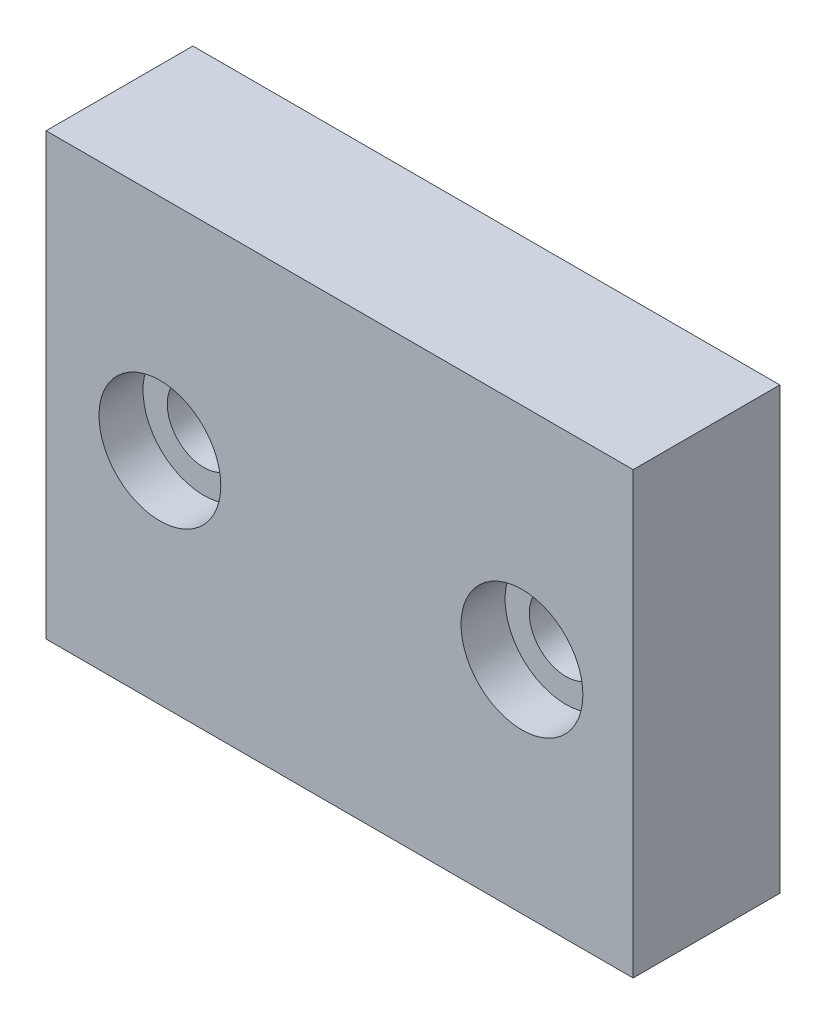
ISO-10303-21;
HEADER;
FILE_DESCRIPTION(('STEP AP214'),'2;1');
FILE_NAME('part.step','',(''),(''),'','','');
FILE_SCHEMA(('AUTOMOTIVE_DESIGN { 1 0 10303 214 1 1 1 1 }'));
ENDSEC;
DATA;
#1=APPLICATION_CONTEXT('core data for automotive mechanical design processes');
#2=APPLICATION_PROTOCOL_DEFINITION('international standard','automotive_design',2000,#1);
#3=PRODUCT_CONTEXT('',#1,'mechanical');
#4=PRODUCT('Part','Part','',(#3));
#5=PRODUCT_RELATED_PRODUCT_CATEGORY('part','',(#4));
#6=PRODUCT_DEFINITION_FORMATION('','',#4);
#7=PRODUCT_DEFINITION_CONTEXT('part definition',#1,'design');
#8=PRODUCT_DEFINITION('design','',#6,#7);
#9=PRODUCT_DEFINITION_SHAPE('','',#8);
#10=(LENGTH_UNIT() NAMED_UNIT(*) SI_UNIT(.MILLI.,.METRE.));
#11=(NAMED_UNIT(*) PLANE_ANGLE_UNIT() SI_UNIT($,.RADIAN.));
#12=(NAMED_UNIT(*) SI_UNIT($,.STERADIAN.) SOLID_ANGLE_UNIT());
#13=UNCERTAINTY_MEASURE_WITH_UNIT(LENGTH_MEASURE(1.E-05),#10,'distance_accuracy_value','');
#14=(GEOMETRIC_REPRESENTATION_CONTEXT(3) GLOBAL_UNCERTAINTY_ASSIGNED_CONTEXT((#13)) GLOBAL_UNIT_ASSIGNED_CONTEXT((#10,
#11,#12)) REPRESENTATION_CONTEXT('',''));
#15=CARTESIAN_POINT('',(0.,0.,0.));
#16=DIRECTION('',(0.,0.,1.));
#17=DIRECTION('',(1.,0.,0.));
#18=AXIS2_PLACEMENT_3D('',#15,#16,#17);
#19=CARTESIAN_POINT('',(-67.7461410245669,15.,40.));
#20=DIRECTION('',(0.,0.,-1.));
#21=DIRECTION('',(-1.,0.,0.));
#22=AXIS2_PLACEMENT_3D('',#19,#20,#21);
#23=CYLINDRICAL_SURFACE('',#22,2.50000000000001);
#24=CARTESIAN_POINT('',(-67.7461410245669,15.,17.5));
#25=DIRECTION('',(0.,0.,1.));
#26=DIRECTION('',(1.,0.,0.));
#27=AXIS2_PLACEMENT_3D('',#24,#25,#26);
#28=CIRCLE('',#27,2.50000000000001);
#29=CARTESIAN_POINT('',(-65.2461410245669,15.,17.5));
#30=VERTEX_POINT('',#29);
#31=EDGE_CURVE('E111',#30,#30,#28,.T.);
#32=ORIENTED_EDGE('',*,*,#31,.F.);
#33=EDGE_LOOP('',(#32));
#34=FACE_BOUND('',#33,.T.);
#35=CARTESIAN_POINT('',(-67.7461410245669,15.,24.5));
#36=DIRECTION('',(0.,0.,1.));
#37=DIRECTION('',(1.,0.,0.));
#38=AXIS2_PLACEMENT_3D('',#35,#36,#37);
#39=CIRCLE('',#38,2.50000000000001);
#40=CARTESIAN_POINT('',(-65.2461410245669,15.,24.5));
#41=VERTEX_POINT('',#40);
#42=EDGE_CURVE('E37',#41,#41,#39,.F.);
#43=ORIENTED_EDGE('',*,*,#42,.F.);
#44=EDGE_LOOP('',(#43));
#45=FACE_BOUND('',#44,.T.);
#46=ADVANCED_FACE('F33',(#34,#45),#23,.F.);
#47=CARTESIAN_POINT('',(-43.0740192619808,15.,40.));
#48=DIRECTION('',(0.,0.,-1.));
#49=DIRECTION('',(-1.,0.,0.));
#50=AXIS2_PLACEMENT_3D('',#47,#48,#49);
#51=CYLINDRICAL_SURFACE('',#50,2.5);
#52=CARTESIAN_POINT('',(-43.0740192619808,15.,17.5));
#53=DIRECTION('',(0.,0.,1.));
#54=DIRECTION('',(1.,0.,0.));
#55=AXIS2_PLACEMENT_3D('',#52,#53,#54);
#56=CIRCLE('',#55,2.5);
#57=CARTESIAN_POINT('',(-40.5740192619808,15.,17.5));
#58=VERTEX_POINT('',#57);
#59=EDGE_CURVE('E102',#58,#58,#56,.T.);
#60=ORIENTED_EDGE('',*,*,#59,.F.);
#61=EDGE_LOOP('',(#60));
#62=FACE_BOUND('',#61,.T.);
#63=CARTESIAN_POINT('',(-43.0740192619808,15.,24.5));
#64=DIRECTION('',(0.,0.,1.));
#65=DIRECTION('',(1.,0.,0.));
#66=AXIS2_PLACEMENT_3D('',#63,#64,#65);
#67=CIRCLE('',#66,2.5);
#68=CARTESIAN_POINT('',(-40.5740192619808,15.,24.5));
#69=VERTEX_POINT('',#68);
#70=EDGE_CURVE('E115',#69,#69,#67,.F.);
#71=ORIENTED_EDGE('',*,*,#70,.F.);
#72=EDGE_LOOP('',(#71));
#73=FACE_BOUND('',#72,.T.);
#74=ADVANCED_FACE('F154',(#62,#73),#51,.F.);
#75=CARTESIAN_POINT('',(-75.4989459475582,0.,27.5));
#76=DIRECTION('',(0.,1.,0.));
#77=DIRECTION('',(-1.,0.,0.));
#78=AXIS2_PLACEMENT_3D('',#75,#76,#77);
#79=PLANE('',#78);
#80=DIRECTION('',(1.,0.,0.));
#81=VECTOR('',#80,1.);
#82=CARTESIAN_POINT('',(-75.4989459475582,0.,17.5));
#83=LINE('',#82,#81);
#84=CARTESIAN_POINT('',(-75.4989459475582,0.,17.5));
#85=VERTEX_POINT('',#84);
#86=CARTESIAN_POINT('',(-35.4989459475582,0.,17.5));
#87=VERTEX_POINT('',#86);
#88=EDGE_CURVE('E100',#85,#87,#83,.T.);
#89=ORIENTED_EDGE('',*,*,#88,.T.);
#90=DIRECTION('',(0.,0.,-1.));
#91=VECTOR('',#90,1.);
#92=CARTESIAN_POINT('',(-35.4989459475582,0.,27.5));
#93=LINE('',#92,#91);
#94=CARTESIAN_POINT('',(-35.4989459475582,0.,27.5));
#95=VERTEX_POINT('',#94);
#96=EDGE_CURVE('E11',#95,#87,#93,.T.);
#97=ORIENTED_EDGE('',*,*,#96,.F.);
#98=DIRECTION('',(1.,0.,0.));
#99=VECTOR('',#98,1.);
#100=CARTESIAN_POINT('',(-75.4989459475582,0.,27.5));
#101=LINE('',#100,#99);
#102=CARTESIAN_POINT('',(-75.4989459475582,0.,27.5));
#103=VERTEX_POINT('',#102);
#104=EDGE_CURVE('E85',#103,#95,#101,.T.);
#105=ORIENTED_EDGE('',*,*,#104,.F.);
#106=DIRECTION('',(0.,0.,-1.));
#107=VECTOR('',#106,1.);
#108=CARTESIAN_POINT('',(-75.4989459475582,0.,27.5));
#109=LINE('',#108,#107);
#110=EDGE_CURVE('E52',#103,#85,#109,.T.);
#111=ORIENTED_EDGE('',*,*,#110,.T.);
#112=EDGE_LOOP('',(#89,#97,#105,#111));
#113=FACE_BOUND('',#112,.T.);
#114=ADVANCED_FACE('F35',(#113),#79,.F.);
#115=CARTESIAN_POINT('',(-35.4989459475582,0.,27.5));
#116=DIRECTION('',(-1.,0.,0.));
#117=DIRECTION('',(0.,0.,1.));
#118=AXIS2_PLACEMENT_3D('',#115,#116,#117);
#119=PLANE('',#118);
#120=DIRECTION('',(0.,1.,0.));
#121=VECTOR('',#120,1.);
#122=CARTESIAN_POINT('',(-35.4989459475582,0.,17.5));
#123=LINE('',#122,#121);
#124=CARTESIAN_POINT('',(-35.4989459475582,30.,17.5));
#125=VERTEX_POINT('',#124);
#126=EDGE_CURVE('E90',#87,#125,#123,.T.);
#127=ORIENTED_EDGE('',*,*,#126,.T.);
#128=DIRECTION('',(0.,0.,-1.));
#129=VECTOR('',#128,1.);
#130=CARTESIAN_POINT('',(-35.4989459475582,30.,27.5));
#131=LINE('',#130,#129);
#132=CARTESIAN_POINT('',(-35.4989459475582,30.,27.5));
#133=VERTEX_POINT('',#132);
#134=EDGE_CURVE('E43',#133,#125,#131,.T.);
#135=ORIENTED_EDGE('',*,*,#134,.F.);
#136=DIRECTION('',(0.,1.,0.));
#137=VECTOR('',#136,1.);
#138=CARTESIAN_POINT('',(-35.4989459475582,0.,27.5));
#139=LINE('',#138,#137);
#140=EDGE_CURVE('E77',#95,#133,#139,.T.);
#141=ORIENTED_EDGE('',*,*,#140,.F.);
#142=ORIENTED_EDGE('',*,*,#96,.T.);
#143=EDGE_LOOP('',(#127,#135,#141,#142));
#144=FACE_BOUND('',#143,.T.);
#145=ADVANCED_FACE('F89',(#144),#119,.F.);
#146=CARTESIAN_POINT('',(-75.4989459475582,30.,27.5));
#147=DIRECTION('',(0.,1.,0.));
#148=DIRECTION('',(0.,0.,1.));
#149=AXIS2_PLACEMENT_3D('',#146,#147,#148);
#150=PLANE('',#149);
#151=DIRECTION('',(1.,0.,0.));
#152=VECTOR('',#151,1.);
#153=CARTESIAN_POINT('',(-75.4989459475582,30.,17.5));
#154=LINE('',#153,#152);
#155=CARTESIAN_POINT('',(-75.4989459475582,30.,17.5));
#156=VERTEX_POINT('',#155);
#157=EDGE_CURVE('E104',#156,#125,#154,.T.);
#158=ORIENTED_EDGE('',*,*,#157,.F.);
#159=DIRECTION('',(0.,0.,-1.));
#160=VECTOR('',#159,1.);
#161=CARTESIAN_POINT('',(-75.4989459475582,30.,27.5));
#162=LINE('',#161,#160);
#163=CARTESIAN_POINT('',(-75.4989459475582,30.,27.5));
#164=VERTEX_POINT('',#163);
#165=EDGE_CURVE('E66',#164,#156,#162,.T.);
#166=ORIENTED_EDGE('',*,*,#165,.F.);
#167=DIRECTION('',(1.,0.,0.));
#168=VECTOR('',#167,1.);
#169=CARTESIAN_POINT('',(-75.4989459475582,30.,27.5));
#170=LINE('',#169,#168);
#171=EDGE_CURVE('E84',#164,#133,#170,.T.);
#172=ORIENTED_EDGE('',*,*,#171,.T.);
#173=ORIENTED_EDGE('',*,*,#134,.T.);
#174=EDGE_LOOP('',(#158,#166,#172,#173));
#175=FACE_BOUND('',#174,.T.);
#176=ADVANCED_FACE('F94',(#175),#150,.T.);
#177=CARTESIAN_POINT('',(-75.4989459475582,0.,27.5));
#178=DIRECTION('',(-1.,0.,0.));
#179=DIRECTION('',(0.,0.,1.));
#180=AXIS2_PLACEMENT_3D('',#177,#178,#179);
#181=PLANE('',#180);
#182=DIRECTION('',(0.,1.,0.));
#183=VECTOR('',#182,1.);
#184=CARTESIAN_POINT('',(-75.4989459475582,0.,17.5));
#185=LINE('',#184,#183);
#186=EDGE_CURVE('E106',#85,#156,#185,.T.);
#187=ORIENTED_EDGE('',*,*,#186,.F.);
#188=ORIENTED_EDGE('',*,*,#110,.F.);
#189=DIRECTION('',(0.,1.,0.));
#190=VECTOR('',#189,1.);
#191=CARTESIAN_POINT('',(-75.4989459475582,0.,27.5));
#192=LINE('',#191,#190);
#193=EDGE_CURVE('E95',#103,#164,#192,.T.);
#194=ORIENTED_EDGE('',*,*,#193,.T.);
#195=ORIENTED_EDGE('',*,*,#165,.T.);
#196=EDGE_LOOP('',(#187,#188,#194,#195));
#197=FACE_BOUND('',#196,.T.);
#198=ADVANCED_FACE('F140',(#197),#181,.T.);
#199=CARTESIAN_POINT('',(0.,0.,27.5));
#200=DIRECTION('',(0.,0.,1.));
#201=DIRECTION('',(1.,0.,0.));
#202=AXIS2_PLACEMENT_3D('',#199,#200,#201);
#203=PLANE('',#202);
#204=CARTESIAN_POINT('',(-67.7461410245669,15.,27.5));
#205=DIRECTION('',(0.,0.,1.));
#206=DIRECTION('',(1.,0.,0.));
#207=AXIS2_PLACEMENT_3D('',#204,#205,#206);
#208=CIRCLE('',#207,4.15);
#209=CARTESIAN_POINT('',(-63.5961410245669,15.,27.5));
#210=VERTEX_POINT('',#209);
#211=EDGE_CURVE('E122',#210,#210,#208,.T.);
#212=ORIENTED_EDGE('',*,*,#211,.F.);
#213=EDGE_LOOP('',(#212));
#214=FACE_BOUND('',#213,.T.);
#215=CARTESIAN_POINT('',(-43.0740192619808,15.,27.5));
#216=DIRECTION('',(0.,0.,1.));
#217=DIRECTION('',(1.,0.,0.));
#218=AXIS2_PLACEMENT_3D('',#215,#216,#217);
#219=CIRCLE('',#218,4.15);
#220=CARTESIAN_POINT('',(-38.9240192619808,15.,27.5));
#221=VERTEX_POINT('',#220);
#222=EDGE_CURVE('E132',#221,#221,#219,.T.);
#223=ORIENTED_EDGE('',*,*,#222,.F.);
#224=EDGE_LOOP('',(#223));
#225=FACE_BOUND('',#224,.T.);
#226=ORIENTED_EDGE('',*,*,#104,.T.);
#227=ORIENTED_EDGE('',*,*,#140,.T.);
#228=ORIENTED_EDGE('',*,*,#171,.F.);
#229=ORIENTED_EDGE('',*,*,#193,.F.);
#230=EDGE_LOOP('',(#226,#227,#228,#229));
#231=FACE_BOUND('',#230,.T.);
#232=ADVANCED_FACE('F81',(#214,#225,#231),#203,.T.);
#233=CARTESIAN_POINT('',(0.,0.,17.5));
#234=DIRECTION('',(0.,0.,1.));
#235=DIRECTION('',(1.,0.,0.));
#236=AXIS2_PLACEMENT_3D('',#233,#234,#235);
#237=PLANE('',#236);
#238=ORIENTED_EDGE('',*,*,#59,.T.);
#239=EDGE_LOOP('',(#238));
#240=FACE_BOUND('',#239,.T.);
#241=ORIENTED_EDGE('',*,*,#31,.T.);
#242=EDGE_LOOP('',(#241));
#243=FACE_BOUND('',#242,.T.);
#244=ORIENTED_EDGE('',*,*,#88,.F.);
#245=ORIENTED_EDGE('',*,*,#186,.T.);
#246=ORIENTED_EDGE('',*,*,#157,.T.);
#247=ORIENTED_EDGE('',*,*,#126,.F.);
#248=EDGE_LOOP('',(#244,#245,#246,#247));
#249=FACE_BOUND('',#248,.T.);
#250=ADVANCED_FACE('F139',(#240,#243,#249),#237,.F.);
#251=CARTESIAN_POINT('',(-43.0740192619808,15.,24.5));
#252=DIRECTION('',(0.,0.,1.));
#253=DIRECTION('',(1.,0.,0.));
#254=AXIS2_PLACEMENT_3D('',#251,#252,#253);
#255=PLANE('',#254);
#256=CARTESIAN_POINT('',(-43.0740192619808,15.,24.5));
#257=DIRECTION('',(0.,0.,1.));
#258=DIRECTION('',(1.,0.,0.));
#259=AXIS2_PLACEMENT_3D('',#256,#257,#258);
#260=CIRCLE('',#259,4.15);
#261=CARTESIAN_POINT('',(-38.9240192619808,15.,24.5));
#262=VERTEX_POINT('',#261);
#263=EDGE_CURVE('E127',#262,#262,#260,.T.);
#264=ORIENTED_EDGE('',*,*,#263,.T.);
#265=EDGE_LOOP('',(#264));
#266=FACE_BOUND('',#265,.T.);
#267=ORIENTED_EDGE('',*,*,#70,.T.);
#268=EDGE_LOOP('',(#267));
#269=FACE_BOUND('',#268,.T.);
#270=ADVANCED_FACE('F147',(#266,#269),#255,.T.);
#271=CARTESIAN_POINT('',(-43.0740192619808,15.,24.5));
#272=DIRECTION('',(0.,0.,1.));
#273=DIRECTION('',(1.,0.,0.));
#274=AXIS2_PLACEMENT_3D('',#271,#272,#273);
#275=CYLINDRICAL_SURFACE('',#274,4.15);
#276=ORIENTED_EDGE('',*,*,#263,.F.);
#277=EDGE_LOOP('',(#276));
#278=FACE_BOUND('',#277,.T.);
#279=ORIENTED_EDGE('',*,*,#222,.T.);
#280=EDGE_LOOP('',(#279));
#281=FACE_BOUND('',#280,.T.);
#282=ADVANCED_FACE('F136',(#278,#281),#275,.F.);
#283=CARTESIAN_POINT('',(-67.7461410245669,15.,24.5));
#284=DIRECTION('',(0.,0.,1.));
#285=DIRECTION('',(1.,0.,0.));
#286=AXIS2_PLACEMENT_3D('',#283,#284,#285);
#287=PLANE('',#286);
#288=CARTESIAN_POINT('',(-67.7461410245669,15.,24.5));
#289=DIRECTION('',(0.,0.,1.));
#290=DIRECTION('',(1.,0.,0.));
#291=AXIS2_PLACEMENT_3D('',#288,#289,#290);
#292=CIRCLE('',#291,4.15);
#293=CARTESIAN_POINT('',(-63.5961410245669,15.,24.5));
#294=VERTEX_POINT('',#293);
#295=EDGE_CURVE('E117',#294,#294,#292,.T.);
#296=ORIENTED_EDGE('',*,*,#295,.T.);
#297=EDGE_LOOP('',(#296));
#298=FACE_BOUND('',#297,.T.);
#299=ORIENTED_EDGE('',*,*,#42,.T.);
#300=EDGE_LOOP('',(#299));
#301=FACE_BOUND('',#300,.T.);
#302=ADVANCED_FACE('F166',(#298,#301),#287,.T.);
#303=CARTESIAN_POINT('',(-67.7461410245669,15.,24.5));
#304=DIRECTION('',(0.,0.,1.));
#305=DIRECTION('',(1.,0.,0.));
#306=AXIS2_PLACEMENT_3D('',#303,#304,#305);
#307=CYLINDRICAL_SURFACE('',#306,4.15);
#308=ORIENTED_EDGE('',*,*,#295,.F.);
#309=EDGE_LOOP('',(#308));
#310=FACE_BOUND('',#309,.T.);
#311=ORIENTED_EDGE('',*,*,#211,.T.);
#312=EDGE_LOOP('',(#311));
#313=FACE_BOUND('',#312,.T.);
#314=ADVANCED_FACE('F171',(#310,#313),#307,.F.);
#315=CLOSED_SHELL('',(#46,#74,#114,#145,#176,#198,#232,#250,#270,#282,#302,#314));
#316=MANIFOLD_SOLID_BREP('B2',#315);
#317=ADVANCED_BREP_SHAPE_REPRESENTATION('',(#18,#316),#14);
#318=SHAPE_DEFINITION_REPRESENTATION(#9,#317);
ENDSEC;
END-ISO-10303-21;
